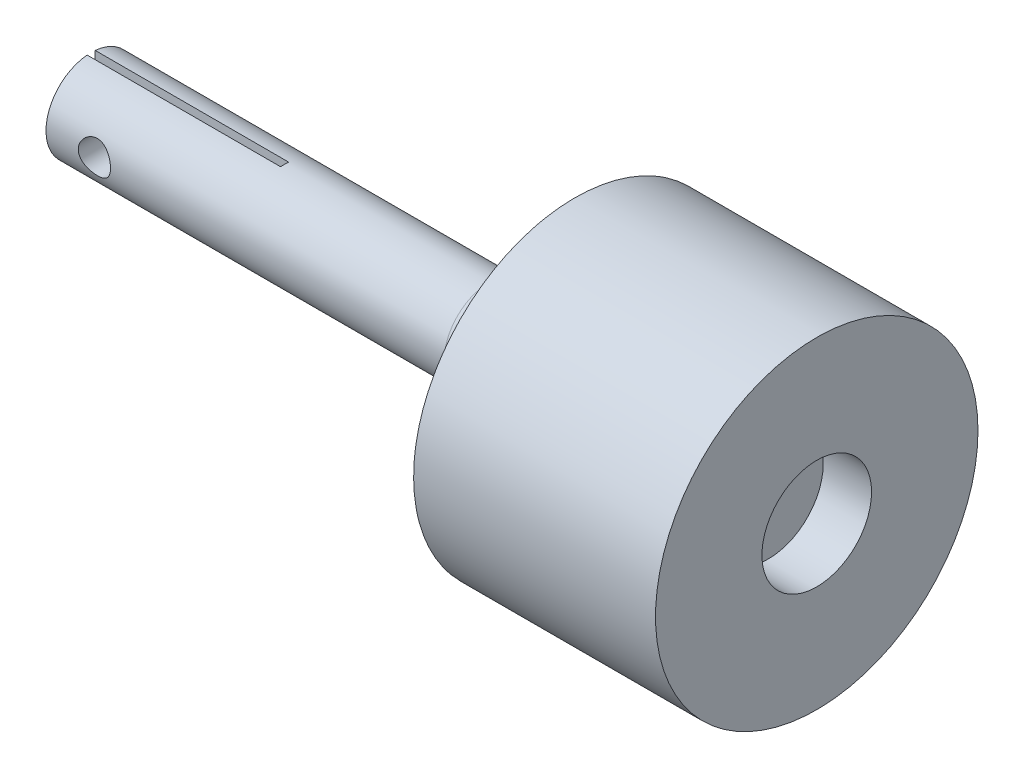
ISO-10303-21;
HEADER;
FILE_DESCRIPTION(('STEP AP214'),'2;1');
FILE_NAME('part.step','',(''),(''),'','','');
FILE_SCHEMA(('AUTOMOTIVE_DESIGN { 1 0 10303 214 1 1 1 1 }'));
ENDSEC;
DATA;
#1=APPLICATION_CONTEXT('core data for automotive mechanical design processes');
#2=APPLICATION_PROTOCOL_DEFINITION('international standard','automotive_design',2000,#1);
#3=PRODUCT_CONTEXT('',#1,'mechanical');
#4=PRODUCT('Part','Part','',(#3));
#5=PRODUCT_RELATED_PRODUCT_CATEGORY('part','',(#4));
#6=PRODUCT_DEFINITION_FORMATION('','',#4);
#7=PRODUCT_DEFINITION_CONTEXT('part definition',#1,'design');
#8=PRODUCT_DEFINITION('design','',#6,#7);
#9=PRODUCT_DEFINITION_SHAPE('','',#8);
#10=(LENGTH_UNIT() NAMED_UNIT(*) SI_UNIT(.MILLI.,.METRE.));
#11=(NAMED_UNIT(*) PLANE_ANGLE_UNIT() SI_UNIT($,.RADIAN.));
#12=(NAMED_UNIT(*) SI_UNIT($,.STERADIAN.) SOLID_ANGLE_UNIT());
#13=UNCERTAINTY_MEASURE_WITH_UNIT(LENGTH_MEASURE(1.E-05),#10,'distance_accuracy_value','');
#14=(GEOMETRIC_REPRESENTATION_CONTEXT(3) GLOBAL_UNCERTAINTY_ASSIGNED_CONTEXT((#13)) GLOBAL_UNIT_ASSIGNED_CONTEXT((#10,
#11,#12)) REPRESENTATION_CONTEXT('',''));
#15=CARTESIAN_POINT('',(0.,0.,0.));
#16=DIRECTION('',(0.,0.,1.));
#17=DIRECTION('',(1.,0.,0.));
#18=AXIS2_PLACEMENT_3D('',#15,#16,#17);
#19=CARTESIAN_POINT('',(30.,0.,0.));
#20=DIRECTION('',(-1.,0.,0.));
#21=DIRECTION('',(0.,0.,1.));
#22=AXIS2_PLACEMENT_3D('',#19,#20,#21);
#23=CYLINDRICAL_SURFACE('',#22,2.8);
#24=CARTESIAN_POINT('',(24.6934003354313,0.,-2.8));
#25=CARTESIAN_POINT('',(24.6934003354342,0.366519142546374,-2.8));
#26=CARTESIAN_POINT('',(24.6934003354313,0.732894076550807,-2.72712349452845));
#27=CARTESIAN_POINT('',(24.6934003354313,1.4101331446937,-2.44660188753475));
#28=CARTESIAN_POINT('',(24.6934003354313,1.7207308161929,-2.23906715845177));
#29=CARTESIAN_POINT('',(24.6934003354313,2.23906715845177,-1.7207308161929));
#30=CARTESIAN_POINT('',(24.6934003354313,2.44660188753453,-1.41013314469425));
#31=CARTESIAN_POINT('',(24.6934003354313,2.72712349452868,-0.732894076550256));
#32=CARTESIAN_POINT('',(24.6934003354313,2.8,-0.366519142545967));
#33=CARTESIAN_POINT('',(24.6934003354313,2.8,0.366519142545966));
#34=CARTESIAN_POINT('',(24.6934003354313,2.7271234945286,0.732894076550462));
#35=CARTESIAN_POINT('',(24.6934003354313,2.44660188753461,1.41013314469404));
#36=CARTESIAN_POINT('',(24.6934003354313,2.23906715845177,1.72073081619289));
#37=CARTESIAN_POINT('',(24.6934003354313,1.72073081619289,2.23906715845178));
#38=CARTESIAN_POINT('',(24.6934003354284,1.41013314469394,2.44660188753465));
#39=CARTESIAN_POINT('',(24.6934003354342,0.732894076550571,2.72712349452855));
#40=CARTESIAN_POINT('',(24.6934003354313,0.366519142545967,2.8));
#41=CARTESIAN_POINT('',(24.6934003354313,-0.366519142545966,2.8));
#42=CARTESIAN_POINT('',(24.6934003354284,-0.732894076550767,2.72712349452847));
#43=CARTESIAN_POINT('',(24.6934003354342,-1.41013314469373,2.44660188753474));
#44=CARTESIAN_POINT('',(24.6934003354313,-1.72073081619289,2.23906715845177));
#45=CARTESIAN_POINT('',(24.6934003354313,-2.23906715845178,1.72073081619289));
#46=CARTESIAN_POINT('',(24.6934003354313,-2.44660188753465,1.41013314469394));
#47=CARTESIAN_POINT('',(24.6934003354313,-2.72712349452855,0.732894076550571));
#48=CARTESIAN_POINT('',(24.6934003354313,-2.8,0.366519142545962));
#49=CARTESIAN_POINT('',(24.6934003354313,-2.8,-0.366519142545971));
#50=CARTESIAN_POINT('',(24.6934003354313,-2.72712349452872,-0.732894076550156));
#51=CARTESIAN_POINT('',(24.6934003354313,-2.44660188753449,-1.41013314469434));
#52=CARTESIAN_POINT('',(24.6934003354313,-2.23906715845105,-1.72073081619361));
#53=CARTESIAN_POINT('',(24.6934003354313,-1.72073081619363,-2.23906715845104));
#54=CARTESIAN_POINT('',(24.6934003354284,-1.41013314469476,-2.44660188753431));
#55=CARTESIAN_POINT('',(24.6934003354342,-0.732894076549747,-2.72712349452889));
#56=CARTESIAN_POINT('',(24.6934003354284,-0.366519142546375,-2.8));
#57=CARTESIAN_POINT('',(24.6934003354313,0.,-2.8));
#58=(BOUNDED_CURVE() B_SPLINE_CURVE(3,(#24,#25,#26,#27,#28,#29,#30,#31,#32,#33,#34,#35,#36,#37,
#38,#39,#40,#41,#42,#43,#44,#45,#46,#47,#48,#49,#50,#51,#52,#53,#54,#55,#56,#57),.UNSPECIFIED.,
.T.,.F.) B_SPLINE_CURVE_WITH_KNOTS((4,2,2,2,2,2,2,2,2,2,2,2,2,2,2,2,4),(0.,0.392699081698724,
0.785398163397448,1.17809724509617,1.5707963267949,1.96349540849362,2.35619449019234,
2.74889357189107,3.14159265358979,3.53429173528852,3.92699081698724,4.31968989868597,
4.71238898038469,5.10508806208341,5.49778714378214,5.89048622548086,6.28318530717959),
.UNSPECIFIED.) CURVE() GEOMETRIC_REPRESENTATION_ITEM() RATIONAL_B_SPLINE_CURVE((1.,1.,1.,1.,1.,
1.,1.,1.,1.,1.,1.,1.,1.,1.,1.,1.,1.,1.,1.,1.,1.,1.,1.,1.,1.,1.,1.,1.,1.,1.,1.,1.,1.,1.)) REPRESENTATION_ITEM(''));
#59=CARTESIAN_POINT('',(24.6934003354313,0.,-2.8));
#60=VERTEX_POINT('',#59);
#61=EDGE_CURVE('E12',#60,#60,#58,.F.);
#62=ORIENTED_EDGE('',*,*,#61,.T.);
#63=EDGE_LOOP('',(#62));
#64=FACE_BOUND('',#63,.T.);
#65=CARTESIAN_POINT('',(0.,0.,0.));
#66=DIRECTION('',(1.,0.,0.));
#67=DIRECTION('',(0.,0.,-1.));
#68=AXIS2_PLACEMENT_3D('',#65,#66,#67);
#69=CIRCLE('',#68,2.8);
#70=CARTESIAN_POINT('',(0.,2.78881695347687,0.25));
#71=VERTEX_POINT('',#70);
#72=CARTESIAN_POINT('',(0.,2.78881695347687,-0.25));
#73=VERTEX_POINT('',#72);
#74=EDGE_CURVE('E118',#71,#73,#69,.T.);
#75=ORIENTED_EDGE('',*,*,#74,.T.);
#76=DIRECTION('',(-1.,0.,0.));
#77=VECTOR('',#76,1.);
#78=CARTESIAN_POINT('',(30.,2.78881695347687,-0.25));
#79=LINE('',#78,#77);
#80=CARTESIAN_POINT('',(12.,2.78881695347687,-0.25));
#81=VERTEX_POINT('',#80);
#82=EDGE_CURVE('E116',#73,#81,#79,.F.);
#83=ORIENTED_EDGE('',*,*,#82,.T.);
#84=CARTESIAN_POINT('',(12.,0.,0.));
#85=DIRECTION('',(-1.,0.,0.));
#86=DIRECTION('',(0.,0.,1.));
#87=AXIS2_PLACEMENT_3D('',#84,#85,#86);
#88=CIRCLE('',#87,2.8);
#89=CARTESIAN_POINT('',(12.,2.78881695347687,0.25));
#90=VERTEX_POINT('',#89);
#91=EDGE_CURVE('E55',#90,#81,#88,.T.);
#92=ORIENTED_EDGE('',*,*,#91,.F.);
#93=DIRECTION('',(-1.,0.,0.));
#94=VECTOR('',#93,1.);
#95=CARTESIAN_POINT('',(30.,2.78881695347687,0.25));
#96=LINE('',#95,#94);
#97=EDGE_CURVE('E112',#90,#71,#96,.T.);
#98=ORIENTED_EDGE('',*,*,#97,.T.);
#99=EDGE_LOOP('',(#75,#83,#92,#98));
#100=FACE_BOUND('',#99,.T.);
#101=CARTESIAN_POINT('',(3.,-1.00559152326157,-2.61319453702637));
#102=CARTESIAN_POINT('',(2.94581583625714,-1.00559270417088,-2.61319350172991));
#103=CARTESIAN_POINT('',(2.89163980981088,-1.0011728147267,-2.61490763309015));
#104=CARTESIAN_POINT('',(2.78490961253958,-0.983681867070271,-2.62153695344931));
#105=CARTESIAN_POINT('',(2.73235552558098,-0.970610362286356,-2.62645230768602));
#106=CARTESIAN_POINT('',(2.63043727910103,-0.936348777699535,-2.63885935029053));
#107=CARTESIAN_POINT('',(2.58106631483222,-0.915176736101611,-2.6463453106857));
#108=CARTESIAN_POINT('',(2.48655969014907,-0.865378722993564,-2.66304469726641));
#109=CARTESIAN_POINT('',(2.44142517396796,-0.836750745526424,-2.67225858815012));
#110=CARTESIAN_POINT('',(2.35462013812696,-0.771460142820544,-2.69184985809865));
#111=CARTESIAN_POINT('',(2.31316981183983,-0.734514402936533,-2.70225958128236));
#112=CARTESIAN_POINT('',(2.23690015737999,-0.654240023266012,-2.72280826557513));
#113=CARTESIAN_POINT('',(2.20208210853297,-0.610910154873144,-2.73294717412207));
#114=CARTESIAN_POINT('',(2.13901665355336,-0.517434282381749,-2.75220011140442));
#115=CARTESIAN_POINT('',(2.11100781331546,-0.467117949852621,-2.7612723570996));
#116=CARTESIAN_POINT('',(2.06394225927365,-0.362107127486806,-2.77699323559544));
#117=CARTESIAN_POINT('',(2.04488276437741,-0.307414003970724,-2.78364262117836));
#118=CARTESIAN_POINT('',(2.01701242918521,-0.197484492534624,-2.79355044094607));
#119=CARTESIAN_POINT('',(2.00782777354089,-0.142354193926773,-2.79693202708521));
#120=CARTESIAN_POINT('',(1.99877729289326,-0.0312377196610274,-2.80037677712182));
#121=CARTESIAN_POINT('',(1.99890868022344,0.0247481949550353,-2.80044093369342));
#122=CARTESIAN_POINT('',(2.00826096500762,0.133282843918552,-2.79732935366024));
#123=CARTESIAN_POINT('',(2.01706858719283,0.185872168615696,-2.79430069703106));
#124=CARTESIAN_POINT('',(2.04283603404691,0.288773892081078,-2.78554796736443));
#125=CARTESIAN_POINT('',(2.05979640643675,0.339086137621256,-2.77982371323091));
#126=CARTESIAN_POINT('',(2.10158648082716,0.436806186236417,-2.76616507114798));
#127=CARTESIAN_POINT('',(2.12651861857964,0.484166017280522,-2.75820208633761));
#128=CARTESIAN_POINT('',(2.18345639759157,0.574144066234325,-2.74088690814369));
#129=CARTESIAN_POINT('',(2.21546417684764,0.616760845105184,-2.73153429514665));
#130=CARTESIAN_POINT('',(2.28763997527333,0.698446229897507,-2.71183187226936));
#131=CARTESIAN_POINT('',(2.32815168295294,0.737205196358174,-2.70145548159697));
#132=CARTESIAN_POINT('',(2.41516997071013,0.807490780085563,-2.68128678808209));
#133=CARTESIAN_POINT('',(2.4616777796901,0.839015911083988,-2.67149460557665));
#134=CARTESIAN_POINT('',(2.560501642775,0.894469482740631,-2.65344941366636));
#135=CARTESIAN_POINT('',(2.61291038601647,0.918244110773872,-2.64522876965292));
#136=CARTESIAN_POINT('',(2.72135430606839,0.956519953145428,-2.63163201231884));
#137=CARTESIAN_POINT('',(2.77738770278769,0.971025681992695,-2.62625451443638));
#138=CARTESIAN_POINT('',(2.88848465203628,0.989685552010179,-2.61927802723335));
#139=CARTESIAN_POINT('',(2.94345611510576,0.994321963840302,-2.61750320830803));
#140=CARTESIAN_POINT('',(3.05340854706268,0.994492532208805,-2.61743871113679));
#141=CARTESIAN_POINT('',(3.10838951131316,0.990028659797159,-2.61914827820025));
#142=CARTESIAN_POINT('',(3.21443819750368,0.972563142392776,-2.62568097412891));
#143=CARTESIAN_POINT('',(3.26557388995844,0.959919783572844,-2.63037330504923));
#144=CARTESIAN_POINT('',(3.36498124362321,0.926896175180284,-2.64219016449614));
#145=CARTESIAN_POINT('',(3.41325235268755,0.906514439607749,-2.64931516014066));
#146=CARTESIAN_POINT('',(3.50741989871313,0.857792843182706,-2.66549625668178));
#147=CARTESIAN_POINT('',(3.55317586130003,0.829201433422258,-2.67461077536913));
#148=CARTESIAN_POINT('',(3.63941497507502,0.765145681149404,-2.69363449446803));
#149=CARTESIAN_POINT('',(3.67989636462694,0.729679052195342,-2.70354395860439));
#150=CARTESIAN_POINT('',(3.75677634599647,0.650533012879929,-2.72370389099987));
#151=CARTESIAN_POINT('',(3.79282110874337,0.606505777201771,-2.73394253594371));
#152=CARTESIAN_POINT('',(3.85704438339149,0.51277296595146,-2.75306166446986));
#153=CARTESIAN_POINT('',(3.88522305893423,0.463067508536061,-2.76194217630425));
#154=CARTESIAN_POINT('',(3.93267869901535,0.359555966017418,-2.77730783962885));
#155=CARTESIAN_POINT('',(3.95200424818753,0.305774196512696,-2.78380602469255));
#156=CARTESIAN_POINT('',(3.98124317979562,0.195443366698758,-2.79371860186559));
#157=CARTESIAN_POINT('',(3.99116050618007,0.138895476416939,-2.79713428613706));
#158=CARTESIAN_POINT('',(4.00090916452853,0.0278752377949744,-2.800382703917));
#159=CARTESIAN_POINT('',(4.00124864302162,-0.0265476422700681,-2.80039625487239));
#160=CARTESIAN_POINT('',(3.99311850413936,-0.134634345788297,-2.7972836544234));
#161=CARTESIAN_POINT('',(3.98464975888394,-0.188298243856622,-2.79415781385753));
#162=CARTESIAN_POINT('',(3.95948936254632,-0.292271808644652,-2.78518384801456));
#163=CARTESIAN_POINT('',(3.94296439424765,-0.342626929395226,-2.77939103205515));
#164=CARTESIAN_POINT('',(3.90232475319611,-0.439858887059174,-2.76567127132179));
#165=CARTESIAN_POINT('',(3.87820864243641,-0.486735062867502,-2.7577439222397));
#166=CARTESIAN_POINT('',(3.82195325274469,-0.577754236561894,-2.7401525879918));
#167=CARTESIAN_POINT('',(3.78952845547638,-0.621709505230371,-2.7304312472909));
#168=CARTESIAN_POINT('',(3.71804120950852,-0.703716177371167,-2.71045533139659));
#169=CARTESIAN_POINT('',(3.67897647527818,-0.741765539316079,-2.70020057344208));
#170=CARTESIAN_POINT('',(3.59313968988683,-0.812701931597102,-2.67972822818928));
#171=CARTESIAN_POINT('',(3.54609267954779,-0.845264419518674,-2.66953479607693));
#172=CARTESIAN_POINT('',(3.44686746397306,-0.902014866716016,-2.65089893580727));
#173=CARTESIAN_POINT('',(3.39468963294208,-0.926203436143617,-2.64245638009321));
#174=CARTESIAN_POINT('',(3.28642525889691,-0.965427037408501,-2.62838171109017));
#175=CARTESIAN_POINT('',(3.23032657109095,-0.980432084042105,-2.62275881497867));
#176=CARTESIAN_POINT('',(3.11614812614243,-1.00051117323216,-2.61516671017253));
#177=CARTESIAN_POINT('',(3.05806939002659,-1.00559025767622,-2.61319564655783));
#178=CARTESIAN_POINT('',(3.,-1.00559152326157,-2.61319453702637));
#179=B_SPLINE_CURVE_WITH_KNOTS('',3,(#101,#102,#103,#104,#105,#106,#107,#108,#109,#110,#111,
#112,#113,#114,#115,#116,#117,#118,#119,#120,#121,#122,#123,#124,#125,#126,#127,#128,#129,#130,
#131,#132,#133,#134,#135,#136,#137,#138,#139,#140,#141,#142,#143,#144,#145,#146,#147,#148,#149,
#150,#151,#152,#153,#154,#155,#156,#157,#158,#159,#160,#161,#162,#163,#164,#165,#166,#167,#168,
#169,#170,#171,#172,#173,#174,#175,#176,#177,#178),.UNSPECIFIED.,.T.,.F.,(4,2,2,2,2,2,2,2,2,2,2,
2,2,2,2,2,2,2,2,2,2,2,2,2,2,2,2,2,2,2,2,2,2,2,2,2,2,2,4),(0.,0.162336658737832,
0.324681697483818,0.486667312136147,0.648696552760548,0.81742086330462,0.986177686850149,
1.16019332511253,1.33415485054799,1.5012701361034,1.66833541547889,1.82780967733409,
1.98729465454365,2.14891742174606,2.31058909227492,2.48086691437704,2.65117969060198,
2.82469148835613,2.99811871092679,3.16285595025152,3.32755751257701,3.48549273900939,
3.6434583090834,3.80690391824585,3.97040397686721,4.143026663558,4.31564575883875,
4.48730585118671,4.65889395139076,4.82136040373214,4.98381077147512,5.14303419859135,
5.30228780592206,5.46799476541774,5.63375887879514,5.80727330379643,5.98077508329162,
6.15484038419645,6.32881724571261),.UNSPECIFIED.);
#180=CARTESIAN_POINT('',(3.,-1.00559152326157,-2.61319453702637));
#181=VERTEX_POINT('',#180);
#182=EDGE_CURVE('E149',#181,#181,#179,.T.);
#183=ORIENTED_EDGE('',*,*,#182,.F.);
#184=EDGE_LOOP('',(#183));
#185=FACE_BOUND('',#184,.T.);
#186=CARTESIAN_POINT('',(3.99998436731162,0.,2.8));
#187=CARTESIAN_POINT('',(3.99968157578981,0.0543518119068015,2.80000081043461));
#188=CARTESIAN_POINT('',(3.99493120221083,0.108670745661306,2.79840329592013));
#189=CARTESIAN_POINT('',(3.97672801849134,0.215645712216398,2.79219764095074));
#190=CARTESIAN_POINT('',(3.96327549478635,0.268301799690549,2.78758959958872));
#191=CARTESIAN_POINT('',(3.92819384891246,0.370394931912321,2.77586854098101));
#192=CARTESIAN_POINT('',(3.90657965010624,0.419837659940304,2.76876009725596));
#193=CARTESIAN_POINT('',(3.85585668852286,0.514398858125232,2.75276162507002));
#194=CARTESIAN_POINT('',(3.82674613482375,0.55951629140507,2.74387117098934));
#195=CARTESIAN_POINT('',(3.76066402140487,0.645907642509414,2.72485405532113));
#196=CARTESIAN_POINT('',(3.72345164304428,0.686990148342238,2.71469487592134));
#197=CARTESIAN_POINT('',(3.64274444972359,0.7624801646494,2.69446733401479));
#198=CARTESIAN_POINT('',(3.5992480098622,0.796885943280569,2.68439899571488));
#199=CARTESIAN_POINT('',(3.50545226801035,0.859156411176013,2.66513603303571));
#200=CARTESIAN_POINT('',(3.45497587960342,0.886767867145321,2.65598118983054));
#201=CARTESIAN_POINT('',(3.34971586374519,0.933024564142187,2.64008862734095));
#202=CARTESIAN_POINT('',(3.2949338056644,0.951673054602365,2.63335003229552));
#203=CARTESIAN_POINT('',(3.18482701109029,0.978750063757841,2.6234043590176));
#204=CARTESIAN_POINT('',(3.12960353912714,0.987542875913959,2.62007183170028));
#205=CARTESIAN_POINT('',(3.01837248241966,0.99579233987817,2.61694844898499));
#206=CARTESIAN_POINT('',(2.9623651799449,0.995252270343698,2.61715634982812));
#207=CARTESIAN_POINT('',(2.85426317791202,0.985142713386496,2.62097654024214));
#208=CARTESIAN_POINT('',(2.80211686969965,0.976046119010187,2.6244105218601));
#209=CARTESIAN_POINT('',(2.70014348343635,0.949844721604288,2.63400601511798));
#210=CARTESIAN_POINT('',(2.65031673247883,0.932738792873097,2.64016791015597));
#211=CARTESIAN_POINT('',(2.55329801448022,0.89068208239375,2.654653746742));
#212=CARTESIAN_POINT('',(2.50617383708684,0.865588835045947,2.66301643249626));
#213=CARTESIAN_POINT('',(2.41665649131316,0.808370693938972,2.68093898406977));
#214=CARTESIAN_POINT('',(2.37426484973599,0.776243540754123,2.69049923414651));
#215=CARTESIAN_POINT('',(2.29275733225226,0.703606626544134,2.71043104768284));
#216=CARTESIAN_POINT('',(2.25398808474001,0.662710940135138,2.72081697384839));
#217=CARTESIAN_POINT('',(2.18376603857555,0.574860521164818,2.74072281614158));
#218=CARTESIAN_POINT('',(2.15231405665551,0.527905113143283,2.75024263552472));
#219=CARTESIAN_POINT('',(2.09734720948402,0.42854537729866,2.76747452658368));
#220=CARTESIAN_POINT('',(2.07392288871241,0.37608708467373,2.7751656942555));
#221=CARTESIAN_POINT('',(2.03634125488208,0.267633217083857,2.78771343248954));
#222=CARTESIAN_POINT('',(2.0221801973454,0.211639081457782,2.79257114832853));
#223=CARTESIAN_POINT('',(2.00415353730186,0.100673601060613,2.79871390692993));
#224=CARTESIAN_POINT('',(1.99981427554316,0.0457881847062379,2.8001634537073));
#225=CARTESIAN_POINT('',(2.00019784579704,-0.063934397976313,2.79980714582579));
#226=CARTESIAN_POINT('',(2.00491898758018,-0.118771571395,2.79800189835659));
#227=CARTESIAN_POINT('',(2.02292355074018,-0.224974275261234,2.79143829309317));
#228=CARTESIAN_POINT('',(2.03592245760996,-0.276394698132204,2.78677825220942));
#229=CARTESIAN_POINT('',(2.0697521692062,-0.376295465146108,2.77505557771295));
#230=CARTESIAN_POINT('',(2.09058404277718,-0.424775406997891,2.76799261622313));
#231=CARTESIAN_POINT('',(2.14017201793885,-0.519026721666987,2.75190227512569));
#232=CARTESIAN_POINT('',(2.16914544761825,-0.564674590196989,2.74282270066413));
#233=CARTESIAN_POINT('',(2.23393707492221,-0.650607526814779,2.72372002562964));
#234=CARTESIAN_POINT('',(2.26975765177193,-0.690890722523309,2.71369659770556));
#235=CARTESIAN_POINT('',(2.34944214106111,-0.767150514500904,2.69316200711302));
#236=CARTESIAN_POINT('',(2.39362909734386,-0.802790980560569,2.68265279959909));
#237=CARTESIAN_POINT('',(2.48758799513525,-0.86619929414364,2.6628566675319));
#238=CARTESIAN_POINT('',(2.53736011997637,-0.893966883135238,2.65356978312299));
#239=CARTESIAN_POINT('',(2.64119541192047,-0.94073720528036,2.63735271703636));
#240=CARTESIAN_POINT('',(2.69525529384486,-0.959746574173525,2.63042075218332));
#241=CARTESIAN_POINT('',(2.80612159159094,-0.988283134810869,2.61983450328631));
#242=CARTESIAN_POINT('',(2.86292648084232,-0.997815534732862,2.61617841905353));
#243=CARTESIAN_POINT('',(2.97401495160832,-1.00671231476979,2.61276682213714));
#244=CARTESIAN_POINT('',(3.02824636354494,-1.00665024662565,2.61279128594208));
#245=CARTESIAN_POINT('',(3.13587826002966,-0.997787201123977,2.61618858762092));
#246=CARTESIAN_POINT('',(3.18927880092506,-0.988986819020572,2.61956119741903));
#247=CARTESIAN_POINT('',(3.2924542653526,-0.963313124287915,2.62910770204165));
#248=CARTESIAN_POINT('',(3.34228533998463,-0.946637795558853,2.63521271480446));
#249=CARTESIAN_POINT('',(3.43848046423913,-0.905850429298399,2.64950935707435));
#250=CARTESIAN_POINT('',(3.48484366134394,-0.881736570549992,2.657701497499));
#251=CARTESIAN_POINT('',(3.57530567367231,-0.825350416750248,2.67576415422859));
#252=CARTESIAN_POINT('',(3.61917464255774,-0.792729886203392,2.68569819837434));
#253=CARTESIAN_POINT('',(3.70099773474347,-0.720832904312137,2.70588113223213));
#254=CARTESIAN_POINT('',(3.73895005495113,-0.681554431548912,2.71613011678726));
#255=CARTESIAN_POINT('',(3.80967081227761,-0.595243021600092,2.73637316790833));
#256=CARTESIAN_POINT('',(3.84211149213592,-0.547932261709247,2.74633257460409));
#257=CARTESIAN_POINT('',(3.89855221977458,-0.448182174445977,2.76436212124485));
#258=CARTESIAN_POINT('',(3.92255299527647,-0.395743289739086,2.77243242405569));
#259=CARTESIAN_POINT('',(3.96131269372733,-0.287042377529552,2.78578705111332));
#260=CARTESIAN_POINT('',(3.9760469832864,-0.230770596813872,2.79106394371281));
#261=CARTESIAN_POINT('',(3.9955428451328,-0.116319506472419,2.79816931898325));
#262=CARTESIAN_POINT('',(4.00030826790923,-0.0581409421668658,2.79999913306604));
#263=CARTESIAN_POINT('',(3.99998436731162,0.,2.8));
#264=B_SPLINE_CURVE_WITH_KNOTS('',3,(#186,#187,#188,#189,#190,#191,#192,#193,#194,#195,#196,
#197,#198,#199,#200,#201,#202,#203,#204,#205,#206,#207,#208,#209,#210,#211,#212,#213,#214,#215,
#216,#217,#218,#219,#220,#221,#222,#223,#224,#225,#226,#227,#228,#229,#230,#231,#232,#233,#234,
#235,#236,#237,#238,#239,#240,#241,#242,#243,#244,#245,#246,#247,#248,#249,#250,#251,#252,#253,
#254,#255,#256,#257,#258,#259,#260,#261,#262,#263),.UNSPECIFIED.,.T.,.F.,(4,2,2,2,2,2,2,2,2,2,2,
2,2,2,2,2,2,2,2,2,2,2,2,2,2,2,2,2,2,2,2,2,2,2,2,2,2,2,4),(0.,0.162843557305116,
0.325681754807981,0.488223638394485,0.650804390248843,0.819113031204537,0.987465270721624,
1.16137140415672,1.33521444203292,1.50239486537706,1.66951655914443,1.82791292177261,
1.98633155349074,2.14775108278828,2.30922253941272,2.48033340734969,2.6514633650372,
2.82446445545257,2.9973955705552,3.16179123869065,3.32615624159304,3.4851561495556,
3.64417776166905,3.807930738127,3.97174071872958,4.14413158406509,4.31652810976606,
4.48879380210899,4.66096477143157,4.8228476897164,4.98471958128999,5.14272246794914,
5.3007640700862,5.46672421328524,5.63273483421593,5.80655322867135,5.98035663214837,
6.15462013111838,6.32881630812455),.UNSPECIFIED.);
#265=CARTESIAN_POINT('',(3.99998436731162,0.,2.8));
#266=VERTEX_POINT('',#265);
#267=EDGE_CURVE('E110',#266,#266,#264,.T.);
#268=ORIENTED_EDGE('',*,*,#267,.F.);
#269=EDGE_LOOP('',(#268));
#270=FACE_BOUND('',#269,.T.);
#271=ADVANCED_FACE('F40',(#64,#100,#185,#270),#23,.T.);
#272=CARTESIAN_POINT('',(0.,0.,0.));
#273=DIRECTION('',(1.,0.,0.));
#274=DIRECTION('',(0.,0.,-1.));
#275=AXIS2_PLACEMENT_3D('',#272,#273,#274);
#276=PLANE('',#275);
#277=DIRECTION('',(0.,0.,1.));
#278=VECTOR('',#277,1.);
#279=CARTESIAN_POINT('',(0.,-2.32901081224555,-0.249999999999999));
#280=LINE('',#279,#278);
#281=CARTESIAN_POINT('',(0.,-2.32901081224555,-0.249999999999999));
#282=VERTEX_POINT('',#281);
#283=CARTESIAN_POINT('',(0.,-2.32901081224555,0.250000000000001));
#284=VERTEX_POINT('',#283);
#285=EDGE_CURVE('E108',#282,#284,#280,.T.);
#286=ORIENTED_EDGE('',*,*,#285,.F.);
#287=DIRECTION('',(0.,1.,0.));
#288=VECTOR('',#287,1.);
#289=CARTESIAN_POINT('',(0.,0.,-0.25));
#290=LINE('',#289,#288);
#291=EDGE_CURVE('E97',#282,#73,#290,.T.);
#292=ORIENTED_EDGE('',*,*,#291,.T.);
#293=ORIENTED_EDGE('',*,*,#74,.F.);
#294=DIRECTION('',(0.,1.,0.));
#295=VECTOR('',#294,1.);
#296=CARTESIAN_POINT('',(0.,3.12152143585721,0.25));
#297=LINE('',#296,#295);
#298=EDGE_CURVE('E93',#284,#71,#297,.T.);
#299=ORIENTED_EDGE('',*,*,#298,.F.);
#300=EDGE_LOOP('',(#286,#292,#293,#299));
#301=FACE_BOUND('',#300,.T.);
#302=ADVANCED_FACE('F144',(#301),#276,.F.);
#303=CARTESIAN_POINT('',(12.,0.,0.));
#304=DIRECTION('',(-1.,0.,0.));
#305=DIRECTION('',(0.,0.,1.));
#306=AXIS2_PLACEMENT_3D('',#303,#304,#305);
#307=PLANE('',#306);
#308=ORIENTED_EDGE('',*,*,#91,.T.);
#309=DIRECTION('',(0.,-1.,0.));
#310=VECTOR('',#309,1.);
#311=CARTESIAN_POINT('',(12.,3.12152143585721,-0.25));
#312=LINE('',#311,#310);
#313=CARTESIAN_POINT('',(12.,-2.32901081224555,-0.249999999999999));
#314=VERTEX_POINT('',#313);
#315=EDGE_CURVE('E88',#81,#314,#312,.T.);
#316=ORIENTED_EDGE('',*,*,#315,.T.);
#317=DIRECTION('',(0.,0.,1.));
#318=VECTOR('',#317,1.);
#319=CARTESIAN_POINT('',(12.,-2.32901081224555,-0.249999999999999));
#320=LINE('',#319,#318);
#321=CARTESIAN_POINT('',(12.,-2.32901081224555,0.250000000000001));
#322=VERTEX_POINT('',#321);
#323=EDGE_CURVE('E90',#314,#322,#320,.T.);
#324=ORIENTED_EDGE('',*,*,#323,.T.);
#325=DIRECTION('',(0.,1.,0.));
#326=VECTOR('',#325,1.);
#327=CARTESIAN_POINT('',(12.,3.12152143585721,0.25));
#328=LINE('',#327,#326);
#329=EDGE_CURVE('E100',#322,#90,#328,.T.);
#330=ORIENTED_EDGE('',*,*,#329,.T.);
#331=EDGE_LOOP('',(#308,#316,#324,#330));
#332=FACE_BOUND('',#331,.T.);
#333=ADVANCED_FACE('F89',(#332),#307,.T.);
#334=CARTESIAN_POINT('',(12.,3.12152143585721,-0.25));
#335=DIRECTION('',(0.,0.,-1.));
#336=DIRECTION('',(0.,1.,0.));
#337=AXIS2_PLACEMENT_3D('',#334,#335,#336);
#338=PLANE('',#337);
#339=CARTESIAN_POINT('',(3.,-0.00559152326156615,-0.25));
#340=DIRECTION('',(0.,0.,-1.));
#341=DIRECTION('',(0.,1.,0.));
#342=AXIS2_PLACEMENT_3D('',#339,#340,#341);
#343=CIRCLE('',#342,1.);
#344=CARTESIAN_POINT('',(3.,0.994408476738434,-0.25));
#345=VERTEX_POINT('',#344);
#346=EDGE_CURVE('E126',#345,#345,#343,.F.);
#347=ORIENTED_EDGE('',*,*,#346,.F.);
#348=EDGE_LOOP('',(#347));
#349=FACE_BOUND('',#348,.T.);
#350=ORIENTED_EDGE('',*,*,#291,.F.);
#351=DIRECTION('',(-1.,0.,0.));
#352=VECTOR('',#351,1.);
#353=CARTESIAN_POINT('',(12.,-2.32901081224555,-0.249999999999999));
#354=LINE('',#353,#352);
#355=EDGE_CURVE('E62',#314,#282,#354,.T.);
#356=ORIENTED_EDGE('',*,*,#355,.F.);
#357=ORIENTED_EDGE('',*,*,#315,.F.);
#358=ORIENTED_EDGE('',*,*,#82,.F.);
#359=EDGE_LOOP('',(#350,#356,#357,#358));
#360=FACE_BOUND('',#359,.T.);
#361=ADVANCED_FACE('F95',(#349,#360),#338,.F.);
#362=CARTESIAN_POINT('',(12.,3.12152143585721,0.25));
#363=DIRECTION('',(0.,0.,1.));
#364=DIRECTION('',(0.,-1.,0.));
#365=AXIS2_PLACEMENT_3D('',#362,#363,#364);
#366=PLANE('',#365);
#367=CARTESIAN_POINT('',(3.,-0.00559152326156609,0.25));
#368=DIRECTION('',(0.,0.,1.));
#369=DIRECTION('',(0.,-1.,0.));
#370=AXIS2_PLACEMENT_3D('',#367,#368,#369);
#371=CIRCLE('',#370,1.);
#372=CARTESIAN_POINT('',(3.,-1.00559152326157,0.25));
#373=VERTEX_POINT('',#372);
#374=EDGE_CURVE('E123',#373,#373,#371,.F.);
#375=ORIENTED_EDGE('',*,*,#374,.F.);
#376=EDGE_LOOP('',(#375));
#377=FACE_BOUND('',#376,.T.);
#378=ORIENTED_EDGE('',*,*,#329,.F.);
#379=DIRECTION('',(-1.,0.,0.));
#380=VECTOR('',#379,1.);
#381=CARTESIAN_POINT('',(12.,-2.32901081224555,0.250000000000001));
#382=LINE('',#381,#380);
#383=EDGE_CURVE('E99',#322,#284,#382,.T.);
#384=ORIENTED_EDGE('',*,*,#383,.T.);
#385=ORIENTED_EDGE('',*,*,#298,.T.);
#386=ORIENTED_EDGE('',*,*,#97,.F.);
#387=EDGE_LOOP('',(#378,#384,#385,#386));
#388=FACE_BOUND('',#387,.T.);
#389=ADVANCED_FACE('F171',(#377,#388),#366,.F.);
#390=CARTESIAN_POINT('',(12.,-2.32901081224555,-0.249999999999999));
#391=DIRECTION('',(0.,-1.,0.));
#392=DIRECTION('',(0.,0.,-1.));
#393=AXIS2_PLACEMENT_3D('',#390,#391,#392);
#394=PLANE('',#393);
#395=ORIENTED_EDGE('',*,*,#285,.T.);
#396=ORIENTED_EDGE('',*,*,#383,.F.);
#397=ORIENTED_EDGE('',*,*,#323,.F.);
#398=ORIENTED_EDGE('',*,*,#355,.T.);
#399=EDGE_LOOP('',(#395,#396,#397,#398));
#400=FACE_BOUND('',#399,.T.);
#401=ADVANCED_FACE('F102',(#400),#394,.F.);
#402=CARTESIAN_POINT('',(3.,-0.00559152326156729,-9.75));
#403=DIRECTION('',(0.,0.,1.));
#404=DIRECTION('',(0.,-1.,0.));
#405=AXIS2_PLACEMENT_3D('',#402,#403,#404);
#406=CYLINDRICAL_SURFACE('',#405,1.);
#407=ORIENTED_EDGE('',*,*,#374,.T.);
#408=EDGE_LOOP('',(#407));
#409=FACE_BOUND('',#408,.T.);
#410=ORIENTED_EDGE('',*,*,#267,.T.);
#411=EDGE_LOOP('',(#410));
#412=FACE_BOUND('',#411,.T.);
#413=ADVANCED_FACE('F159',(#409,#412),#406,.F.);
#414=ORIENTED_EDGE('',*,*,#346,.T.);
#415=EDGE_LOOP('',(#414));
#416=FACE_BOUND('',#415,.T.);
#417=ORIENTED_EDGE('',*,*,#182,.T.);
#418=EDGE_LOOP('',(#417));
#419=FACE_BOUND('',#418,.T.);
#420=ADVANCED_FACE('F163',(#416,#419),#406,.F.);
#421=CARTESIAN_POINT('',(45.,0.,0.));
#422=DIRECTION('',(-1.,0.,0.));
#423=DIRECTION('',(0.,0.,1.));
#424=AXIS2_PLACEMENT_3D('',#421,#422,#423);
#425=CYLINDRICAL_SURFACE('',#424,10.);
#426=CARTESIAN_POINT('',(45.,0.,0.));
#427=DIRECTION('',(1.,0.,0.));
#428=DIRECTION('',(0.,0.,-1.));
#429=AXIS2_PLACEMENT_3D('',#426,#427,#428);
#430=CIRCLE('',#429,10.);
#431=CARTESIAN_POINT('',(45.,0.,-10.));
#432=VERTEX_POINT('',#431);
#433=EDGE_CURVE('E127',#432,#432,#430,.T.);
#434=ORIENTED_EDGE('',*,*,#433,.F.);
#435=EDGE_LOOP('',(#434));
#436=FACE_BOUND('',#435,.T.);
#437=CARTESIAN_POINT('',(30.,0.,-10.));
#438=CARTESIAN_POINT('',(30.,-1.30899693766563,-10.));
#439=CARTESIAN_POINT('',(30.,-2.61747884482281,-9.73972676617489));
#440=CARTESIAN_POINT('',(30.,-5.03618980247902,-8.73786388405086));
#441=CARTESIAN_POINT('',(30.0000000000029,-6.1454672006909,-7.99666842303862));
#442=CARTESIAN_POINT('',(29.9999999999971,-7.99666842304011,-6.14546720069232));
#443=CARTESIAN_POINT('',(30.0000000000029,-8.73786388405233,-5.03618980247863));
#444=CARTESIAN_POINT('',(29.9999999999971,-9.73972676617345,-2.61747884482314));
#445=CARTESIAN_POINT('',(30.,-10.,-1.30899693766419));
#446=CARTESIAN_POINT('',(30.,-10.,1.30899693766415));
#447=CARTESIAN_POINT('',(30.,-9.73972676617198,2.61747884482426));
#448=CARTESIAN_POINT('',(30.,-8.73786388405377,5.03618980247757));
#449=CARTESIAN_POINT('',(29.9999999999971,-7.99666842304082,6.14546720069015));
#450=CARTESIAN_POINT('',(30.0000000000029,-6.14546720069016,7.99666842304081));
#451=CARTESIAN_POINT('',(30.0000000000029,-5.036189802479,8.73786388405232));
#452=CARTESIAN_POINT('',(29.9999999999971,-2.61747884482278,9.73972676617345));
#453=CARTESIAN_POINT('',(30.,-1.30899693766417,10.));
#454=CARTESIAN_POINT('',(30.,1.30899693766417,10.));
#455=CARTESIAN_POINT('',(30.,2.61747884482354,9.73972676617198));
#456=CARTESIAN_POINT('',(30.,5.0361898024783,8.73786388405376));
#457=CARTESIAN_POINT('',(29.9999999999971,6.14546720069015,7.99666842304082));
#458=CARTESIAN_POINT('',(30.0000000000029,7.99666842304081,6.14546720069016));
#459=CARTESIAN_POINT('',(30.0000000000029,8.73786388405232,5.03618980247792));
#460=CARTESIAN_POINT('',(29.9999999999971,9.73972676617344,2.61747884482389));
#461=CARTESIAN_POINT('',(30.,10.,1.30899693766417));
#462=CARTESIAN_POINT('',(30.,10.,-1.30899693766417));
#463=CARTESIAN_POINT('',(30.,9.73972676617344,-2.61747884482352));
#464=CARTESIAN_POINT('',(30.,8.73786388405232,-5.03618980247828));
#465=CARTESIAN_POINT('',(30.,7.99666842303732,-6.1454672006922));
#466=CARTESIAN_POINT('',(30.,6.14546720069365,-7.99666842303877));
#467=CARTESIAN_POINT('',(30.,5.03618980247815,-8.73786388405268));
#468=CARTESIAN_POINT('',(30.,2.61747884482366,-9.73972676617309));
#469=CARTESIAN_POINT('',(30.,1.30899693766563,-10.));
#470=CARTESIAN_POINT('',(30.,0.,-10.));
#471=(BOUNDED_CURVE() B_SPLINE_CURVE(3,(#437,#438,#439,#440,#441,#442,#443,#444,#445,#446,#447,
#448,#449,#450,#451,#452,#453,#454,#455,#456,#457,#458,#459,#460,#461,#462,#463,#464,#465,#466,
#467,#468,#469,#470),.UNSPECIFIED.,.T.,.F.) B_SPLINE_CURVE_WITH_KNOTS((4,2,2,2,2,2,2,2,2,2,2,2,
2,2,2,2,4),(0.,0.392699081698725,0.785398163397448,1.17809724509617,1.5707963267949,
1.96349540849362,2.35619449019234,2.74889357189107,3.14159265358979,3.53429173528852,
3.92699081698724,4.31968989868597,4.71238898038469,5.10508806208341,5.49778714378214,
5.89048622548086,6.28318530717959),
.UNSPECIFIED.) CURVE() GEOMETRIC_REPRESENTATION_ITEM() RATIONAL_B_SPLINE_CURVE((1.,1.,1.,1.,1.,
1.,1.,1.,1.,1.,1.,1.,1.,1.,1.,1.,1.,1.,1.,1.,1.,1.,1.,1.,1.,1.,1.,1.,1.,1.,1.,1.,1.,1.)) REPRESENTATION_ITEM(''));
#472=CARTESIAN_POINT('',(30.,0.,-10.));
#473=VERTEX_POINT('',#472);
#474=EDGE_CURVE('E187',#473,#473,#471,.F.);
#475=ORIENTED_EDGE('',*,*,#474,.T.);
#476=EDGE_LOOP('',(#475));
#477=FACE_BOUND('',#476,.T.);
#478=ADVANCED_FACE('F165',(#436,#477),#425,.T.);
#479=CARTESIAN_POINT('',(45.,0.,0.));
#480=DIRECTION('',(1.,0.,0.));
#481=DIRECTION('',(0.,0.,-1.));
#482=AXIS2_PLACEMENT_3D('',#479,#480,#481);
#483=PLANE('',#482);
#484=CARTESIAN_POINT('',(45.,0.,0.));
#485=DIRECTION('',(1.,0.,0.));
#486=DIRECTION('',(0.,0.,-1.));
#487=AXIS2_PLACEMENT_3D('',#484,#485,#486);
#488=CIRCLE('',#487,3.4);
#489=CARTESIAN_POINT('',(45.,0.,-3.4));
#490=VERTEX_POINT('',#489);
#491=EDGE_CURVE('E188',#490,#490,#488,.T.);
#492=ORIENTED_EDGE('',*,*,#491,.F.);
#493=EDGE_LOOP('',(#492));
#494=FACE_BOUND('',#493,.T.);
#495=ORIENTED_EDGE('',*,*,#433,.T.);
#496=EDGE_LOOP('',(#495));
#497=FACE_BOUND('',#496,.T.);
#498=ADVANCED_FACE('F217',(#494,#497),#483,.T.);
#499=CARTESIAN_POINT('',(30.,0.,-10.));
#500=CARTESIAN_POINT('',(30.,1.30899693766563,-10.));
#501=CARTESIAN_POINT('',(30.,2.61747884482366,-9.73972676617309));
#502=CARTESIAN_POINT('',(30.,5.03618980247815,-8.73786388405268));
#503=CARTESIAN_POINT('',(30.,6.14546720069365,-7.99666842303877));
#504=CARTESIAN_POINT('',(30.,7.99666842303732,-6.1454672006922));
#505=CARTESIAN_POINT('',(30.,8.73786388405232,-5.03618980247828));
#506=CARTESIAN_POINT('',(30.,9.73972676617344,-2.61747884482352));
#507=CARTESIAN_POINT('',(30.,10.,-1.30899693766417));
#508=CARTESIAN_POINT('',(30.,10.,1.30899693766417));
#509=CARTESIAN_POINT('',(29.9999999999971,9.73972676617344,2.61747884482389));
#510=CARTESIAN_POINT('',(30.0000000000029,8.73786388405232,5.03618980247792));
#511=CARTESIAN_POINT('',(30.0000000000029,7.99666842304081,6.14546720069016));
#512=CARTESIAN_POINT('',(29.9999999999971,6.14546720069015,7.99666842304082));
#513=CARTESIAN_POINT('',(30.,5.0361898024783,8.73786388405376));
#514=CARTESIAN_POINT('',(30.,2.61747884482354,9.73972676617198));
#515=CARTESIAN_POINT('',(30.,1.30899693766417,10.));
#516=CARTESIAN_POINT('',(30.,-1.30899693766417,10.));
#517=CARTESIAN_POINT('',(29.9999999999971,-2.61747884482278,9.73972676617345));
#518=CARTESIAN_POINT('',(30.0000000000029,-5.036189802479,8.73786388405232));
#519=CARTESIAN_POINT('',(30.0000000000029,-6.14546720069016,7.99666842304081));
#520=CARTESIAN_POINT('',(29.9999999999971,-7.99666842304082,6.14546720069015));
#521=CARTESIAN_POINT('',(30.,-8.73786388405377,5.03618980247757));
#522=CARTESIAN_POINT('',(30.,-9.73972676617198,2.61747884482426));
#523=CARTESIAN_POINT('',(30.,-10.,1.30899693766415));
#524=CARTESIAN_POINT('',(30.,-10.,-1.30899693766419));
#525=CARTESIAN_POINT('',(29.9999999999971,-9.73972676617345,-2.61747884482314));
#526=CARTESIAN_POINT('',(30.0000000000029,-8.73786388405233,-5.03618980247863));
#527=CARTESIAN_POINT('',(29.9999999999971,-7.99666842304011,-6.14546720069232));
#528=CARTESIAN_POINT('',(30.0000000000029,-6.1454672006909,-7.99666842303862));
#529=CARTESIAN_POINT('',(30.,-5.03618980247902,-8.73786388405086));
#530=CARTESIAN_POINT('',(30.,-2.61747884482281,-9.73972676617489));
#531=CARTESIAN_POINT('',(30.,-1.30899693766563,-10.));
#532=CARTESIAN_POINT('',(30.,0.,-10.));
#533=CARTESIAN_POINT('',(26.2009570583202,0.,-2.8));
#534=CARTESIAN_POINT('',(26.2009570583114,0.366519142546374,-2.79999999999855));
#535=CARTESIAN_POINT('',(26.2009570583173,0.732894076550012,-2.72712349452538));
#536=CARTESIAN_POINT('',(26.2009570583231,1.41013314469449,-2.44660188753783));
#537=CARTESIAN_POINT('',(26.2009570583202,1.72073081619326,-2.23906715845214));
#538=CARTESIAN_POINT('',(26.2009570583202,2.23906715845141,-1.72073081619254));
#539=CARTESIAN_POINT('',(26.2009570583202,2.44660188753773,-1.41013314469582));
#540=CARTESIAN_POINT('',(26.2009570583202,2.72712349452548,-0.732894076548681));
#541=CARTESIAN_POINT('',(26.2009570583202,2.8,-0.366519142545966));
#542=CARTESIAN_POINT('',(26.2009570583202,2.8,0.366519142545966));
#543=CARTESIAN_POINT('',(26.2009570583144,2.72712349452548,0.732894076549409));
#544=CARTESIAN_POINT('',(26.200957058326,2.44660188753772,1.4101331446951));
#545=CARTESIAN_POINT('',(26.200957058326,2.23906715845177,1.72073081619435));
#546=CARTESIAN_POINT('',(26.2009570583144,1.72073081619289,2.23906715845032));
#547=CARTESIAN_POINT('',(26.2009570583231,1.41013314469365,2.44660188753482));
#548=CARTESIAN_POINT('',(26.2009570583173,0.732894076550866,2.72712349452839));
#549=CARTESIAN_POINT('',(26.2009570583202,0.366519142545967,2.8));
#550=CARTESIAN_POINT('',(26.2009570583202,-0.366519142545966,2.8));
#551=CARTESIAN_POINT('',(26.2009570583202,-0.732894076549767,2.72712349452693));
#552=CARTESIAN_POINT('',(26.2009570583202,-1.41013314469473,2.44660188753627));
#553=CARTESIAN_POINT('',(26.200957058326,-1.72073081619435,2.23906715845468));
#554=CARTESIAN_POINT('',(26.2009570583144,-2.23906715845032,1.72073081618998));
#555=CARTESIAN_POINT('',(26.2009570583202,-2.44660188753337,1.41013314469328));
#556=CARTESIAN_POINT('',(26.2009570583202,-2.72712349452984,0.732894076551228));
#557=CARTESIAN_POINT('',(26.2009570583173,-2.8,0.366519142545962));
#558=CARTESIAN_POINT('',(26.2009570583231,-2.8,-0.366519142545971));
#559=CARTESIAN_POINT('',(26.2009570583144,-2.72712349453275,-0.732894076551948));
#560=CARTESIAN_POINT('',(26.200957058326,-2.44660188753046,-1.41013314469255));
#561=CARTESIAN_POINT('',(26.2009570583144,-2.23906715845105,-1.72073081619289));
#562=CARTESIAN_POINT('',(26.200957058326,-1.72073081619362,-2.23906715845177));
#563=CARTESIAN_POINT('',(26.2009570583231,-1.41013314469401,-2.44660188753337));
#564=CARTESIAN_POINT('',(26.2009570583173,-0.732894076550501,-2.72712349452984));
#565=CARTESIAN_POINT('',(26.2009570583289,-0.366519142546375,-2.80000000000145));
#566=CARTESIAN_POINT('',(26.2009570583202,0.,-2.8));
#567=CARTESIAN_POINT('',(24.6934003354313,0.,-2.8));
#568=CARTESIAN_POINT('',(24.6934003354342,0.366519142546374,-2.8));
#569=CARTESIAN_POINT('',(24.6934003354313,0.732894076550807,-2.72712349452845));
#570=CARTESIAN_POINT('',(24.6934003354313,1.4101331446937,-2.44660188753475));
#571=CARTESIAN_POINT('',(24.6934003354313,1.7207308161929,-2.23906715845177));
#572=CARTESIAN_POINT('',(24.6934003354313,2.23906715845177,-1.7207308161929));
#573=CARTESIAN_POINT('',(24.6934003354313,2.44660188753453,-1.41013314469425));
#574=CARTESIAN_POINT('',(24.6934003354313,2.72712349452868,-0.732894076550256));
#575=CARTESIAN_POINT('',(24.6934003354313,2.8,-0.366519142545967));
#576=CARTESIAN_POINT('',(24.6934003354313,2.8,0.366519142545966));
#577=CARTESIAN_POINT('',(24.6934003354313,2.7271234945286,0.732894076550462));
#578=CARTESIAN_POINT('',(24.6934003354313,2.44660188753461,1.41013314469404));
#579=CARTESIAN_POINT('',(24.6934003354313,2.23906715845177,1.72073081619289));
#580=CARTESIAN_POINT('',(24.6934003354313,1.72073081619289,2.23906715845178));
#581=CARTESIAN_POINT('',(24.6934003354284,1.41013314469394,2.44660188753465));
#582=CARTESIAN_POINT('',(24.6934003354342,0.732894076550571,2.72712349452855));
#583=CARTESIAN_POINT('',(24.6934003354313,0.366519142545967,2.8));
#584=CARTESIAN_POINT('',(24.6934003354313,-0.366519142545966,2.8));
#585=CARTESIAN_POINT('',(24.6934003354284,-0.732894076550767,2.72712349452847));
#586=CARTESIAN_POINT('',(24.6934003354342,-1.41013314469373,2.44660188753474));
#587=CARTESIAN_POINT('',(24.6934003354313,-1.72073081619289,2.23906715845177));
#588=CARTESIAN_POINT('',(24.6934003354313,-2.23906715845178,1.72073081619289));
#589=CARTESIAN_POINT('',(24.6934003354313,-2.44660188753465,1.41013314469394));
#590=CARTESIAN_POINT('',(24.6934003354313,-2.72712349452855,0.732894076550571));
#591=CARTESIAN_POINT('',(24.6934003354313,-2.8,0.366519142545962));
#592=CARTESIAN_POINT('',(24.6934003354313,-2.8,-0.366519142545971));
#593=CARTESIAN_POINT('',(24.6934003354313,-2.72712349452872,-0.732894076550156));
#594=CARTESIAN_POINT('',(24.6934003354313,-2.44660188753449,-1.41013314469434));
#595=CARTESIAN_POINT('',(24.6934003354313,-2.23906715845105,-1.72073081619361));
#596=CARTESIAN_POINT('',(24.6934003354313,-1.72073081619363,-2.23906715845104));
#597=CARTESIAN_POINT('',(24.6934003354284,-1.41013314469476,-2.44660188753431));
#598=CARTESIAN_POINT('',(24.6934003354342,-0.732894076549747,-2.72712349452889));
#599=CARTESIAN_POINT('',(24.6934003354284,-0.366519142546375,-2.8));
#600=CARTESIAN_POINT('',(24.6934003354313,0.,-2.8));
#601=(BOUNDED_SURFACE() B_SPLINE_SURFACE(2,3,((#499,#500,#501,#502,#503,#504,#505,#506,#507,
#508,#509,#510,#511,#512,#513,#514,#515,#516,#517,#518,#519,#520,#521,#522,#523,#524,#525,#526,
#527,#528,#529,#530,#531,#532),(#533,#534,#535,#536,#537,#538,#539,#540,#541,#542,#543,#544,
#545,#546,#547,#548,#549,#550,#551,#552,#553,#554,#555,#556,#557,#558,#559,#560,#561,#562,#563,
#564,#565,#566),(#567,#568,#569,#570,#571,#572,#573,#574,#575,#576,#577,#578,#579,#580,#581,
#582,#583,#584,#585,#586,#587,#588,#589,#590,#591,#592,#593,#594,#595,#596,#597,#598,#599,
#600)),.UNSPECIFIED.,.F.,.T.,.F.) B_SPLINE_SURFACE_WITH_KNOTS((3,3),(4,2,2,2,2,2,2,2,2,2,2,2,2,
2,2,2,4),(0.,1.),(0.,0.392699081698724,0.785398163397448,1.17809724509617,1.5707963267949,
1.96349540849362,2.35619449019234,2.74889357189107,3.14159265358979,3.53429173528852,
3.92699081698724,4.31968989868597,4.71238898038469,5.10508806208341,5.49778714378214,
5.89048622548086,6.28318530717959),
.UNSPECIFIED.) GEOMETRIC_REPRESENTATION_ITEM() RATIONAL_B_SPLINE_SURFACE(((1.,1.,1.,1.,1.,1.,1.,
1.,1.,1.,1.,1.,1.,1.,1.,1.,1.,1.,1.,1.,1.,1.,1.,1.,1.,1.,1.,1.,1.,1.,1.,1.,1.,1.),
(0.856348838577675,0.856348838577675,0.856348838577675,0.856348838577675,0.856348838577675,
0.856348838577675,0.856348838577675,0.856348838577675,0.856348838577675,0.856348838577675,
0.856348838577675,0.856348838577675,0.856348838577675,0.856348838577675,0.856348838577675,
0.856348838577675,0.856348838577675,0.856348838577675,0.856348838577675,0.856348838577675,
0.856348838577675,0.856348838577675,0.856348838577675,0.856348838577675,0.856348838577675,
0.856348838577675,0.856348838577675,0.856348838577675,0.856348838577675,0.856348838577675,
0.856348838577675,0.856348838577675,0.856348838577675,0.856348838577675),(1.,1.,1.,1.,1.,1.,1.,
1.,1.,1.,1.,1.,1.,1.,1.,1.,1.,1.,1.,1.,1.,1.,1.,1.,1.,1.,1.,1.,1.,1.,1.,1.,1.,1.))) REPRESENTATION_ITEM('') SURFACE());
#602=ORIENTED_EDGE('',*,*,#61,.F.);
#603=EDGE_LOOP('',(#602));
#604=FACE_BOUND('',#603,.T.);
#605=ORIENTED_EDGE('',*,*,#474,.F.);
#606=EDGE_LOOP('',(#605));
#607=FACE_BOUND('',#606,.T.);
#608=ADVANCED_FACE('F43',(#604,#607),#601,.T.);
#609=CARTESIAN_POINT('',(42.,0.,0.));
#610=DIRECTION('',(1.,0.,0.));
#611=DIRECTION('',(0.,0.,-1.));
#612=AXIS2_PLACEMENT_3D('',#609,#610,#611);
#613=CYLINDRICAL_SURFACE('',#612,3.4);
#614=CARTESIAN_POINT('',(42.,0.,0.));
#615=DIRECTION('',(1.,0.,0.));
#616=DIRECTION('',(0.,0.,-1.));
#617=AXIS2_PLACEMENT_3D('',#614,#615,#616);
#618=CIRCLE('',#617,3.4);
#619=CARTESIAN_POINT('',(42.,0.,-3.4));
#620=VERTEX_POINT('',#619);
#621=EDGE_CURVE('E191',#620,#620,#618,.T.);
#622=ORIENTED_EDGE('',*,*,#621,.F.);
#623=EDGE_LOOP('',(#622));
#624=FACE_BOUND('',#623,.T.);
#625=ORIENTED_EDGE('',*,*,#491,.T.);
#626=EDGE_LOOP('',(#625));
#627=FACE_BOUND('',#626,.T.);
#628=ADVANCED_FACE('F216',(#624,#627),#613,.F.);
#629=CARTESIAN_POINT('',(42.,0.,0.));
#630=DIRECTION('',(1.,0.,0.));
#631=DIRECTION('',(0.,0.,-1.));
#632=AXIS2_PLACEMENT_3D('',#629,#630,#631);
#633=PLANE('',#632);
#634=ORIENTED_EDGE('',*,*,#621,.T.);
#635=EDGE_LOOP('',(#634));
#636=FACE_BOUND('',#635,.T.);
#637=ADVANCED_FACE('F222',(#636),#633,.T.);
#638=CLOSED_SHELL('',(#271,#302,#333,#361,#389,#401,#413,#420,#478,#498,#608,#628,#637));
#639=MANIFOLD_SOLID_BREP('B2',#638);
#640=ADVANCED_BREP_SHAPE_REPRESENTATION('',(#18,#639),#14);
#641=SHAPE_DEFINITION_REPRESENTATION(#9,#640);
ENDSEC;
END-ISO-10303-21;
